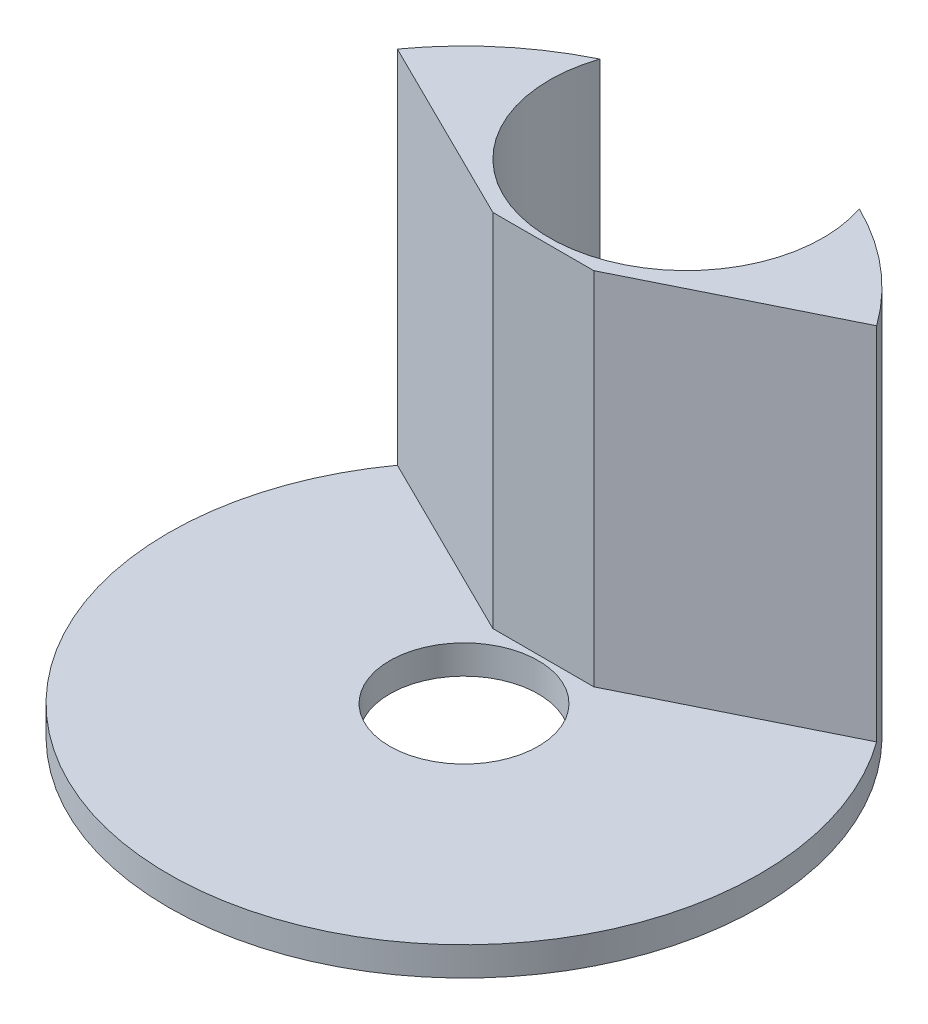
ISO-10303-21;
HEADER;
FILE_DESCRIPTION(('STEP AP214'),'2;1');
FILE_NAME('part.step','',(''),(''),'','','');
FILE_SCHEMA(('AUTOMOTIVE_DESIGN { 1 0 10303 214 1 1 1 1 }'));
ENDSEC;
DATA;
#1=APPLICATION_CONTEXT('core data for automotive mechanical design processes');
#2=APPLICATION_PROTOCOL_DEFINITION('international standard','automotive_design',2000,#1);
#3=PRODUCT_CONTEXT('',#1,'mechanical');
#4=PRODUCT('Part','Part','',(#3));
#5=PRODUCT_RELATED_PRODUCT_CATEGORY('part','',(#4));
#6=PRODUCT_DEFINITION_FORMATION('','',#4);
#7=PRODUCT_DEFINITION_CONTEXT('part definition',#1,'design');
#8=PRODUCT_DEFINITION('design','',#6,#7);
#9=PRODUCT_DEFINITION_SHAPE('','',#8);
#10=(LENGTH_UNIT() NAMED_UNIT(*) SI_UNIT(.MILLI.,.METRE.));
#11=(NAMED_UNIT(*) PLANE_ANGLE_UNIT() SI_UNIT($,.RADIAN.));
#12=(NAMED_UNIT(*) SI_UNIT($,.STERADIAN.) SOLID_ANGLE_UNIT());
#13=UNCERTAINTY_MEASURE_WITH_UNIT(LENGTH_MEASURE(1.E-05),#10,'distance_accuracy_value','');
#14=(GEOMETRIC_REPRESENTATION_CONTEXT(3) GLOBAL_UNCERTAINTY_ASSIGNED_CONTEXT((#13)) GLOBAL_UNIT_ASSIGNED_CONTEXT((#10,
#11,#12)) REPRESENTATION_CONTEXT('',''));
#15=CARTESIAN_POINT('',(0.,0.,0.));
#16=DIRECTION('',(0.,0.,1.));
#17=DIRECTION('',(1.,0.,0.));
#18=AXIS2_PLACEMENT_3D('',#15,#16,#17);
#19=CARTESIAN_POINT('',(0.,2.,0.));
#20=DIRECTION('',(0.,1.,0.));
#21=DIRECTION('',(0.,0.,1.));
#22=AXIS2_PLACEMENT_3D('',#19,#20,#21);
#23=PLANE('',#22);
#24=CARTESIAN_POINT('',(0.,2.,-13.));
#25=DIRECTION('',(0.,1.,0.));
#26=DIRECTION('',(0.,0.,1.));
#27=AXIS2_PLACEMENT_3D('',#24,#25,#26);
#28=CIRCLE('',#27,6.5);
#29=CARTESIAN_POINT('',(0.,2.,-6.5));
#30=VERTEX_POINT('',#29);
#31=EDGE_CURVE('E158',#30,#30,#28,.T.);
#32=ORIENTED_EDGE('',*,*,#31,.F.);
#33=EDGE_LOOP('',(#32));
#34=FACE_BOUND('',#33,.T.);
#35=CARTESIAN_POINT('',(0.,2.,0.));
#36=DIRECTION('',(0.,1.,0.));
#37=DIRECTION('',(0.,0.,1.));
#38=AXIS2_PLACEMENT_3D('',#35,#36,#37);
#39=CIRCLE('',#38,20.5);
#40=CARTESIAN_POINT('',(8.99999999999999,2.,-18.4187404563939));
#41=VERTEX_POINT('',#40);
#42=CARTESIAN_POINT('',(-9.00000000000001,2.,-18.4187404563939));
#43=VERTEX_POINT('',#42);
#44=EDGE_CURVE('E11',#41,#43,#39,.T.);
#45=ORIENTED_EDGE('',*,*,#44,.T.);
#46=CARTESIAN_POINT('',(0.,2.,-15.4184489779728));
#47=DIRECTION('',(0.,1.,0.));
#48=DIRECTION('',(0.,0.,1.));
#49=AXIS2_PLACEMENT_3D('',#46,#47,#48);
#50=CIRCLE('',#49,9.48692515810502);
#51=EDGE_CURVE('E136',#43,#41,#50,.T.);
#52=ORIENTED_EDGE('',*,*,#51,.T.);
#53=EDGE_LOOP('',(#45,#52));
#54=FACE_BOUND('',#53,.T.);
#55=ADVANCED_FACE('F41',(#34,#54),#23,.T.);
#56=CARTESIAN_POINT('',(0.,2.,0.));
#57=DIRECTION('',(0.,-1.,0.));
#58=DIRECTION('',(0.,0.,-1.));
#59=AXIS2_PLACEMENT_3D('',#56,#57,#58);
#60=CYLINDRICAL_SURFACE('',#59,20.5);
#61=ORIENTED_EDGE('',*,*,#44,.F.);
#62=DIRECTION('',(0.,-1.,0.));
#63=VECTOR('',#62,1.);
#64=CARTESIAN_POINT('',(8.99999999999999,27.,-18.4187404563939));
#65=LINE('',#64,#63);
#66=CARTESIAN_POINT('',(8.99999999999999,27.,-18.4187404563939));
#67=VERTEX_POINT('',#66);
#68=EDGE_CURVE('E91',#67,#41,#65,.T.);
#69=ORIENTED_EDGE('',*,*,#68,.F.);
#70=CARTESIAN_POINT('',(0.,27.,0.));
#71=DIRECTION('',(0.,1.,0.));
#72=DIRECTION('',(0.,0.,1.));
#73=AXIS2_PLACEMENT_3D('',#70,#71,#72);
#74=CIRCLE('',#73,20.5);
#75=CARTESIAN_POINT('',(16.6207701385947,27.,-12.));
#76=VERTEX_POINT('',#75);
#77=EDGE_CURVE('E68',#76,#67,#74,.T.);
#78=ORIENTED_EDGE('',*,*,#77,.F.);
#79=DIRECTION('',(0.,-1.,0.));
#80=VECTOR('',#79,1.);
#81=CARTESIAN_POINT('',(16.6207701385947,27.,-12.));
#82=LINE('',#81,#80);
#83=CARTESIAN_POINT('',(16.6207701385947,2.,-12.));
#84=VERTEX_POINT('',#83);
#85=EDGE_CURVE('E125',#76,#84,#82,.T.);
#86=ORIENTED_EDGE('',*,*,#85,.T.);
#87=CARTESIAN_POINT('',(-16.6207701385947,2.,-12.));
#88=VERTEX_POINT('',#87);
#89=EDGE_CURVE('E51',#88,#84,#39,.T.);
#90=ORIENTED_EDGE('',*,*,#89,.F.);
#91=DIRECTION('',(0.,-1.,0.));
#92=VECTOR('',#91,1.);
#93=CARTESIAN_POINT('',(-16.6207701385947,27.,-12.));
#94=LINE('',#93,#92);
#95=CARTESIAN_POINT('',(-16.6207701385947,27.,-12.));
#96=VERTEX_POINT('',#95);
#97=EDGE_CURVE('E59',#96,#88,#94,.T.);
#98=ORIENTED_EDGE('',*,*,#97,.F.);
#99=CARTESIAN_POINT('',(-9.00000000000001,27.,-18.4187404563939));
#100=VERTEX_POINT('',#99);
#101=EDGE_CURVE('E133',#100,#96,#74,.T.);
#102=ORIENTED_EDGE('',*,*,#101,.F.);
#103=DIRECTION('',(0.,-1.,0.));
#104=VECTOR('',#103,1.);
#105=CARTESIAN_POINT('',(-9.00000000000001,27.,-18.4187404563939));
#106=LINE('',#105,#104);
#107=EDGE_CURVE('E96',#100,#43,#106,.T.);
#108=ORIENTED_EDGE('',*,*,#107,.T.);
#109=EDGE_LOOP('',(#61,#69,#78,#86,#90,#98,#102,#108));
#110=FACE_BOUND('',#109,.T.);
#111=CARTESIAN_POINT('',(0.,0.,0.));
#112=DIRECTION('',(0.,1.,0.));
#113=DIRECTION('',(0.,0.,1.));
#114=AXIS2_PLACEMENT_3D('',#111,#112,#113);
#115=CIRCLE('',#114,20.5);
#116=CARTESIAN_POINT('',(0.,0.,20.5));
#117=VERTEX_POINT('',#116);
#118=EDGE_CURVE('E171',#117,#117,#115,.T.);
#119=ORIENTED_EDGE('',*,*,#118,.T.);
#120=EDGE_LOOP('',(#119));
#121=FACE_BOUND('',#120,.T.);
#122=ADVANCED_FACE('F43',(#110,#121),#60,.T.);
#123=DIRECTION('',(0.896070683062667,0.,-0.443911399893724));
#124=VECTOR('',#123,1.);
#125=CARTESIAN_POINT('',(-1.49806729392679,2.,-3.02396871011691));
#126=LINE('',#125,#124);
#127=CARTESIAN_POINT('',(3.5,2.,-5.5));
#128=VERTEX_POINT('',#127);
#129=EDGE_CURVE('E144',#128,#84,#126,.T.);
#130=ORIENTED_EDGE('',*,*,#129,.F.);
#131=DIRECTION('',(1.,0.,0.));
#132=VECTOR('',#131,1.);
#133=CARTESIAN_POINT('',(0.,2.,-5.5));
#134=LINE('',#133,#132);
#135=CARTESIAN_POINT('',(-3.5,2.,-5.5));
#136=VERTEX_POINT('',#135);
#137=EDGE_CURVE('E120',#136,#128,#134,.T.);
#138=ORIENTED_EDGE('',*,*,#137,.F.);
#139=DIRECTION('',(-0.896070683062667,0.,-0.443911399893724));
#140=VECTOR('',#139,1.);
#141=CARTESIAN_POINT('',(1.49806729392679,2.,-3.02396871011691));
#142=LINE('',#141,#140);
#143=EDGE_CURVE('E139',#136,#88,#142,.T.);
#144=ORIENTED_EDGE('',*,*,#143,.T.);
#145=ORIENTED_EDGE('',*,*,#89,.T.);
#146=EDGE_LOOP('',(#130,#138,#144,#145));
#147=FACE_BOUND('',#146,.T.);
#148=CARTESIAN_POINT('',(0.,2.,0.));
#149=DIRECTION('',(0.,1.,0.));
#150=DIRECTION('',(0.,0.,1.));
#151=AXIS2_PLACEMENT_3D('',#148,#149,#150);
#152=CIRCLE('',#151,5.15);
#153=CARTESIAN_POINT('',(0.,2.,5.15));
#154=VERTEX_POINT('',#153);
#155=EDGE_CURVE('E163',#154,#154,#152,.T.);
#156=ORIENTED_EDGE('',*,*,#155,.F.);
#157=EDGE_LOOP('',(#156));
#158=FACE_BOUND('',#157,.T.);
#159=ADVANCED_FACE('F197',(#147,#158),#23,.T.);
#160=CARTESIAN_POINT('',(0.,0.,0.));
#161=DIRECTION('',(0.,1.,0.));
#162=DIRECTION('',(0.,0.,1.));
#163=AXIS2_PLACEMENT_3D('',#160,#161,#162);
#164=PLANE('',#163);
#165=CARTESIAN_POINT('',(0.,0.,-13.));
#166=DIRECTION('',(0.,1.,0.));
#167=DIRECTION('',(0.,0.,1.));
#168=AXIS2_PLACEMENT_3D('',#165,#166,#167);
#169=CIRCLE('',#168,6.5);
#170=CARTESIAN_POINT('',(0.,0.,-6.5));
#171=VERTEX_POINT('',#170);
#172=EDGE_CURVE('E159',#171,#171,#169,.T.);
#173=ORIENTED_EDGE('',*,*,#172,.T.);
#174=EDGE_LOOP('',(#173));
#175=FACE_BOUND('',#174,.T.);
#176=CARTESIAN_POINT('',(0.,0.,0.));
#177=DIRECTION('',(0.,1.,0.));
#178=DIRECTION('',(0.,0.,1.));
#179=AXIS2_PLACEMENT_3D('',#176,#177,#178);
#180=CIRCLE('',#179,5.15);
#181=CARTESIAN_POINT('',(0.,0.,5.15));
#182=VERTEX_POINT('',#181);
#183=EDGE_CURVE('E45',#182,#182,#180,.T.);
#184=ORIENTED_EDGE('',*,*,#183,.T.);
#185=EDGE_LOOP('',(#184));
#186=FACE_BOUND('',#185,.T.);
#187=ORIENTED_EDGE('',*,*,#118,.F.);
#188=EDGE_LOOP('',(#187));
#189=FACE_BOUND('',#188,.T.);
#190=ADVANCED_FACE('F180',(#175,#186,#189),#164,.F.);
#191=CARTESIAN_POINT('',(0.,-1.,0.));
#192=DIRECTION('',(0.,1.,0.));
#193=DIRECTION('',(0.,0.,1.));
#194=AXIS2_PLACEMENT_3D('',#191,#192,#193);
#195=CYLINDRICAL_SURFACE('',#194,5.15);
#196=ORIENTED_EDGE('',*,*,#155,.T.);
#197=EDGE_LOOP('',(#196));
#198=FACE_BOUND('',#197,.T.);
#199=ORIENTED_EDGE('',*,*,#183,.F.);
#200=EDGE_LOOP('',(#199));
#201=FACE_BOUND('',#200,.T.);
#202=ADVANCED_FACE('F183',(#198,#201),#195,.F.);
#203=CARTESIAN_POINT('',(0.,0.,-13.));
#204=DIRECTION('',(0.,1.,0.));
#205=DIRECTION('',(0.,0.,1.));
#206=AXIS2_PLACEMENT_3D('',#203,#204,#205);
#207=CYLINDRICAL_SURFACE('',#206,6.5);
#208=ORIENTED_EDGE('',*,*,#172,.F.);
#209=EDGE_LOOP('',(#208));
#210=FACE_BOUND('',#209,.T.);
#211=ORIENTED_EDGE('',*,*,#31,.T.);
#212=EDGE_LOOP('',(#211));
#213=FACE_BOUND('',#212,.T.);
#214=ADVANCED_FACE('F185',(#210,#213),#207,.F.);
#215=CARTESIAN_POINT('',(0.,27.,-15.4184489779728));
#216=DIRECTION('',(0.,-1.,0.));
#217=DIRECTION('',(0.,0.,-1.));
#218=AXIS2_PLACEMENT_3D('',#215,#216,#217);
#219=CYLINDRICAL_SURFACE('',#218,9.48692515810502);
#220=ORIENTED_EDGE('',*,*,#51,.F.);
#221=ORIENTED_EDGE('',*,*,#107,.F.);
#222=CARTESIAN_POINT('',(0.,27.,-15.4184489779728));
#223=DIRECTION('',(0.,1.,0.));
#224=DIRECTION('',(0.,0.,1.));
#225=AXIS2_PLACEMENT_3D('',#222,#223,#224);
#226=CIRCLE('',#225,9.48692515810502);
#227=EDGE_CURVE('E147',#100,#67,#226,.T.);
#228=ORIENTED_EDGE('',*,*,#227,.T.);
#229=ORIENTED_EDGE('',*,*,#68,.T.);
#230=EDGE_LOOP('',(#220,#221,#228,#229));
#231=FACE_BOUND('',#230,.T.);
#232=ADVANCED_FACE('F193',(#231),#219,.F.);
#233=CARTESIAN_POINT('',(1.49806729392679,27.,-3.02396871011691));
#234=DIRECTION('',(-0.443911399893724,0.,0.896070683062667));
#235=DIRECTION('',(0.896070683062667,0.,0.443911399893724));
#236=AXIS2_PLACEMENT_3D('',#233,#234,#235);
#237=PLANE('',#236);
#238=ORIENTED_EDGE('',*,*,#143,.F.);
#239=DIRECTION('',(0.,-1.,0.));
#240=VECTOR('',#239,1.);
#241=CARTESIAN_POINT('',(-3.5,27.,-5.5));
#242=LINE('',#241,#240);
#243=CARTESIAN_POINT('',(-3.5,27.,-5.5));
#244=VERTEX_POINT('',#243);
#245=EDGE_CURVE('E124',#244,#136,#242,.T.);
#246=ORIENTED_EDGE('',*,*,#245,.F.);
#247=DIRECTION('',(-0.896070683062667,0.,-0.443911399893724));
#248=VECTOR('',#247,1.);
#249=CARTESIAN_POINT('',(1.49806729392679,27.,-3.02396871011691));
#250=LINE('',#249,#248);
#251=EDGE_CURVE('E112',#244,#96,#250,.T.);
#252=ORIENTED_EDGE('',*,*,#251,.T.);
#253=ORIENTED_EDGE('',*,*,#97,.T.);
#254=EDGE_LOOP('',(#238,#246,#252,#253));
#255=FACE_BOUND('',#254,.T.);
#256=ADVANCED_FACE('F222',(#255),#237,.T.);
#257=CARTESIAN_POINT('',(0.,27.,-5.5));
#258=DIRECTION('',(0.,0.,-1.));
#259=DIRECTION('',(-1.,0.,0.));
#260=AXIS2_PLACEMENT_3D('',#257,#258,#259);
#261=PLANE('',#260);
#262=ORIENTED_EDGE('',*,*,#137,.T.);
#263=DIRECTION('',(0.,-1.,0.));
#264=VECTOR('',#263,1.);
#265=CARTESIAN_POINT('',(3.5,27.,-5.5));
#266=LINE('',#265,#264);
#267=CARTESIAN_POINT('',(3.5,27.,-5.5));
#268=VERTEX_POINT('',#267);
#269=EDGE_CURVE('E117',#268,#128,#266,.T.);
#270=ORIENTED_EDGE('',*,*,#269,.F.);
#271=DIRECTION('',(1.,0.,0.));
#272=VECTOR('',#271,1.);
#273=CARTESIAN_POINT('',(0.,27.,-5.5));
#274=LINE('',#273,#272);
#275=EDGE_CURVE('E106',#244,#268,#274,.T.);
#276=ORIENTED_EDGE('',*,*,#275,.F.);
#277=ORIENTED_EDGE('',*,*,#245,.T.);
#278=EDGE_LOOP('',(#262,#270,#276,#277));
#279=FACE_BOUND('',#278,.T.);
#280=ADVANCED_FACE('F118',(#279),#261,.F.);
#281=CARTESIAN_POINT('',(-1.49806729392679,27.,-3.02396871011691));
#282=DIRECTION('',(-0.443911399893724,0.,-0.896070683062667));
#283=DIRECTION('',(-0.896070683062667,0.,0.443911399893724));
#284=AXIS2_PLACEMENT_3D('',#281,#282,#283);
#285=PLANE('',#284);
#286=ORIENTED_EDGE('',*,*,#129,.T.);
#287=ORIENTED_EDGE('',*,*,#85,.F.);
#288=DIRECTION('',(0.896070683062667,0.,-0.443911399893724));
#289=VECTOR('',#288,1.);
#290=CARTESIAN_POINT('',(-1.49806729392679,27.,-3.02396871011691));
#291=LINE('',#290,#289);
#292=EDGE_CURVE('E110',#268,#76,#291,.T.);
#293=ORIENTED_EDGE('',*,*,#292,.F.);
#294=ORIENTED_EDGE('',*,*,#269,.T.);
#295=EDGE_LOOP('',(#286,#287,#293,#294));
#296=FACE_BOUND('',#295,.T.);
#297=ADVANCED_FACE('F127',(#296),#285,.F.);
#298=CARTESIAN_POINT('',(0.,27.,0.));
#299=DIRECTION('',(0.,1.,0.));
#300=DIRECTION('',(0.,0.,1.));
#301=AXIS2_PLACEMENT_3D('',#298,#299,#300);
#302=PLANE('',#301);
#303=ORIENTED_EDGE('',*,*,#227,.F.);
#304=ORIENTED_EDGE('',*,*,#101,.T.);
#305=ORIENTED_EDGE('',*,*,#251,.F.);
#306=ORIENTED_EDGE('',*,*,#275,.T.);
#307=ORIENTED_EDGE('',*,*,#292,.T.);
#308=ORIENTED_EDGE('',*,*,#77,.T.);
#309=EDGE_LOOP('',(#303,#304,#305,#306,#307,#308));
#310=FACE_BOUND('',#309,.T.);
#311=ADVANCED_FACE('F108',(#310),#302,.T.);
#312=CLOSED_SHELL('',(#55,#122,#159,#190,#202,#214,#232,#256,#280,#297,#311));
#313=MANIFOLD_SOLID_BREP('B2',#312);
#314=ADVANCED_BREP_SHAPE_REPRESENTATION('',(#18,#313),#14);
#315=SHAPE_DEFINITION_REPRESENTATION(#9,#314);
ENDSEC;
END-ISO-10303-21;
